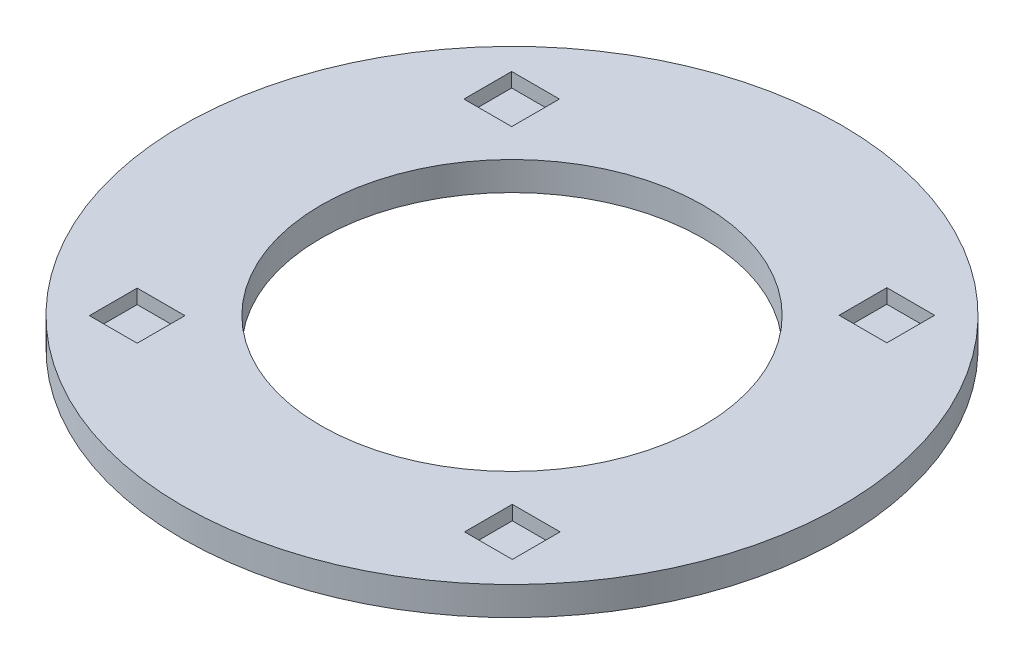
ISO-10303-21;
HEADER;
FILE_DESCRIPTION(('STEP AP214'),'2;1');
FILE_NAME('part.step','',(''),(''),'','','');
FILE_SCHEMA(('AUTOMOTIVE_DESIGN { 1 0 10303 214 1 1 1 1 }'));
ENDSEC;
DATA;
#1=APPLICATION_CONTEXT('core data for automotive mechanical design processes');
#2=APPLICATION_PROTOCOL_DEFINITION('international standard','automotive_design',2000,#1);
#3=PRODUCT_CONTEXT('',#1,'mechanical');
#4=PRODUCT('Part','Part','',(#3));
#5=PRODUCT_RELATED_PRODUCT_CATEGORY('part','',(#4));
#6=PRODUCT_DEFINITION_FORMATION('','',#4);
#7=PRODUCT_DEFINITION_CONTEXT('part definition',#1,'design');
#8=PRODUCT_DEFINITION('design','',#6,#7);
#9=PRODUCT_DEFINITION_SHAPE('','',#8);
#10=(LENGTH_UNIT() NAMED_UNIT(*) SI_UNIT(.MILLI.,.METRE.));
#11=(NAMED_UNIT(*) PLANE_ANGLE_UNIT() SI_UNIT($,.RADIAN.));
#12=(NAMED_UNIT(*) SI_UNIT($,.STERADIAN.) SOLID_ANGLE_UNIT());
#13=UNCERTAINTY_MEASURE_WITH_UNIT(LENGTH_MEASURE(1.E-05),#10,'distance_accuracy_value','');
#14=(GEOMETRIC_REPRESENTATION_CONTEXT(3) GLOBAL_UNCERTAINTY_ASSIGNED_CONTEXT((#13)) GLOBAL_UNIT_ASSIGNED_CONTEXT((#10,
#11,#12)) REPRESENTATION_CONTEXT('',''));
#15=CARTESIAN_POINT('',(0.,0.,0.));
#16=DIRECTION('',(0.,0.,1.));
#17=DIRECTION('',(1.,0.,0.));
#18=AXIS2_PLACEMENT_3D('',#15,#16,#17);
#19=CARTESIAN_POINT('',(0.,3.,0.));
#20=DIRECTION('',(0.,-1.,0.));
#21=DIRECTION('',(0.,0.,-1.));
#22=AXIS2_PLACEMENT_3D('',#19,#20,#21);
#23=CYLINDRICAL_SURFACE('',#22,34.5);
#24=CARTESIAN_POINT('',(0.,3.,0.));
#25=DIRECTION('',(0.,1.,0.));
#26=DIRECTION('',(0.,0.,1.));
#27=AXIS2_PLACEMENT_3D('',#24,#25,#26);
#28=CIRCLE('',#27,34.5);
#29=CARTESIAN_POINT('',(0.,3.,34.5));
#30=VERTEX_POINT('',#29);
#31=EDGE_CURVE('E11',#30,#30,#28,.T.);
#32=ORIENTED_EDGE('',*,*,#31,.F.);
#33=EDGE_LOOP('',(#32));
#34=FACE_BOUND('',#33,.T.);
#35=CARTESIAN_POINT('',(0.,0.,0.));
#36=DIRECTION('',(0.,1.,0.));
#37=DIRECTION('',(0.,0.,1.));
#38=AXIS2_PLACEMENT_3D('',#35,#36,#37);
#39=CIRCLE('',#38,34.5);
#40=CARTESIAN_POINT('',(0.,0.,34.5));
#41=VERTEX_POINT('',#40);
#42=EDGE_CURVE('E38',#41,#41,#39,.T.);
#43=ORIENTED_EDGE('',*,*,#42,.T.);
#44=EDGE_LOOP('',(#43));
#45=FACE_BOUND('',#44,.T.);
#46=ADVANCED_FACE('F35',(#34,#45),#23,.T.);
#47=CARTESIAN_POINT('',(0.,3.,0.));
#48=DIRECTION('',(0.,1.,0.));
#49=DIRECTION('',(0.,0.,1.));
#50=AXIS2_PLACEMENT_3D('',#47,#48,#49);
#51=PLANE('',#50);
#52=DIRECTION('',(1.,0.,0.));
#53=VECTOR('',#52,1.);
#54=CARTESIAN_POINT('',(-22.1031686077329,3.,22.1367412709515));
#55=LINE('',#54,#53);
#56=CARTESIAN_POINT('',(-22.1031686077329,3.,22.1367412709515));
#57=VERTEX_POINT('',#56);
#58=CARTESIAN_POINT('',(-17.1031686077329,3.,22.1367412709515));
#59=VERTEX_POINT('',#58);
#60=EDGE_CURVE('E49',#57,#59,#55,.T.);
#61=ORIENTED_EDGE('',*,*,#60,.F.);
#62=DIRECTION('',(0.,0.,1.));
#63=VECTOR('',#62,1.);
#64=CARTESIAN_POINT('',(-22.1031686077329,3.,17.1367412709515));
#65=LINE('',#64,#63);
#66=CARTESIAN_POINT('',(-22.1031686077329,3.,17.1367412709515));
#67=VERTEX_POINT('',#66);
#68=EDGE_CURVE('E225',#67,#57,#65,.T.);
#69=ORIENTED_EDGE('',*,*,#68,.F.);
#70=DIRECTION('',(-1.,0.,0.));
#71=VECTOR('',#70,1.);
#72=CARTESIAN_POINT('',(-22.1031686077329,3.,17.1367412709515));
#73=LINE('',#72,#71);
#74=CARTESIAN_POINT('',(-17.1031686077329,3.,17.1367412709515));
#75=VERTEX_POINT('',#74);
#76=EDGE_CURVE('E239',#75,#67,#73,.T.);
#77=ORIENTED_EDGE('',*,*,#76,.F.);
#78=DIRECTION('',(0.,0.,-1.));
#79=VECTOR('',#78,1.);
#80=CARTESIAN_POINT('',(-17.1031686077329,3.,17.1367412709515));
#81=LINE('',#80,#79);
#82=EDGE_CURVE('E236',#59,#75,#81,.T.);
#83=ORIENTED_EDGE('',*,*,#82,.F.);
#84=EDGE_LOOP('',(#61,#69,#77,#83));
#85=FACE_BOUND('',#84,.T.);
#86=DIRECTION('',(0.,0.,-1.));
#87=VECTOR('',#86,1.);
#88=CARTESIAN_POINT('',(22.1367412709555,3.,22.103168607733));
#89=LINE('',#88,#87);
#90=CARTESIAN_POINT('',(22.1367412709555,3.,22.103168607733));
#91=VERTEX_POINT('',#90);
#92=CARTESIAN_POINT('',(22.1367412709555,3.,17.103168607733));
#93=VERTEX_POINT('',#92);
#94=EDGE_CURVE('E57',#91,#93,#89,.T.);
#95=ORIENTED_EDGE('',*,*,#94,.F.);
#96=DIRECTION('',(1.,0.,0.));
#97=VECTOR('',#96,1.);
#98=CARTESIAN_POINT('',(17.1367412709555,3.,22.103168607733));
#99=LINE('',#98,#97);
#100=CARTESIAN_POINT('',(17.1367412709555,3.,22.103168607733));
#101=VERTEX_POINT('',#100);
#102=EDGE_CURVE('E195',#101,#91,#99,.T.);
#103=ORIENTED_EDGE('',*,*,#102,.F.);
#104=DIRECTION('',(0.,0.,1.));
#105=VECTOR('',#104,1.);
#106=CARTESIAN_POINT('',(17.1367412709555,3.,22.103168607733));
#107=LINE('',#106,#105);
#108=CARTESIAN_POINT('',(17.1367412709555,3.,17.103168607733));
#109=VERTEX_POINT('',#108);
#110=EDGE_CURVE('E210',#109,#101,#107,.T.);
#111=ORIENTED_EDGE('',*,*,#110,.F.);
#112=DIRECTION('',(-1.,0.,0.));
#113=VECTOR('',#112,1.);
#114=CARTESIAN_POINT('',(17.1367412709555,3.,17.103168607733));
#115=LINE('',#114,#113);
#116=EDGE_CURVE('E206',#93,#109,#115,.T.);
#117=ORIENTED_EDGE('',*,*,#116,.F.);
#118=EDGE_LOOP('',(#95,#103,#111,#117));
#119=FACE_BOUND('',#118,.T.);
#120=DIRECTION('',(-1.,0.,0.));
#121=VECTOR('',#120,1.);
#122=CARTESIAN_POINT('',(22.103168607737,3.,-22.1367412709553));
#123=LINE('',#122,#121);
#124=CARTESIAN_POINT('',(22.103168607737,3.,-22.1367412709553));
#125=VERTEX_POINT('',#124);
#126=CARTESIAN_POINT('',(17.103168607737,3.,-22.1367412709553));
#127=VERTEX_POINT('',#126);
#128=EDGE_CURVE('E154',#125,#127,#123,.T.);
#129=ORIENTED_EDGE('',*,*,#128,.F.);
#130=DIRECTION('',(0.,0.,-1.));
#131=VECTOR('',#130,1.);
#132=CARTESIAN_POINT('',(22.103168607737,3.,-17.1367412709553));
#133=LINE('',#132,#131);
#134=CARTESIAN_POINT('',(22.103168607737,3.,-17.1367412709553));
#135=VERTEX_POINT('',#134);
#136=EDGE_CURVE('E171',#135,#125,#133,.T.);
#137=ORIENTED_EDGE('',*,*,#136,.F.);
#138=DIRECTION('',(1.,0.,0.));
#139=VECTOR('',#138,1.);
#140=CARTESIAN_POINT('',(22.103168607737,3.,-17.1367412709553));
#141=LINE('',#140,#139);
#142=CARTESIAN_POINT('',(17.103168607737,3.,-17.1367412709553));
#143=VERTEX_POINT('',#142);
#144=EDGE_CURVE('E174',#143,#135,#141,.T.);
#145=ORIENTED_EDGE('',*,*,#144,.F.);
#146=DIRECTION('',(0.,0.,1.));
#147=VECTOR('',#146,1.);
#148=CARTESIAN_POINT('',(17.103168607737,3.,-17.1367412709553));
#149=LINE('',#148,#147);
#150=EDGE_CURVE('E180',#127,#143,#149,.T.);
#151=ORIENTED_EDGE('',*,*,#150,.F.);
#152=EDGE_LOOP('',(#129,#137,#145,#151));
#153=FACE_BOUND('',#152,.T.);
#154=DIRECTION('',(0.,0.,1.));
#155=VECTOR('',#154,1.);
#156=CARTESIAN_POINT('',(-22.1367412709513,3.,-22.1031686077369));
#157=LINE('',#156,#155);
#158=CARTESIAN_POINT('',(-22.1367412709513,3.,-22.1031686077369));
#159=VERTEX_POINT('',#158);
#160=CARTESIAN_POINT('',(-22.1367412709513,3.,-17.1031686077369));
#161=VERTEX_POINT('',#160);
#162=EDGE_CURVE('E187',#159,#161,#157,.T.);
#163=ORIENTED_EDGE('',*,*,#162,.F.);
#164=DIRECTION('',(-1.,0.,0.));
#165=VECTOR('',#164,1.);
#166=CARTESIAN_POINT('',(-17.1367412709513,3.,-22.1031686077369));
#167=LINE('',#166,#165);
#168=CARTESIAN_POINT('',(-17.1367412709513,3.,-22.1031686077369));
#169=VERTEX_POINT('',#168);
#170=EDGE_CURVE('E254',#169,#159,#167,.T.);
#171=ORIENTED_EDGE('',*,*,#170,.F.);
#172=DIRECTION('',(0.,0.,-1.));
#173=VECTOR('',#172,1.);
#174=CARTESIAN_POINT('',(-17.1367412709513,3.,-22.1031686077369));
#175=LINE('',#174,#173);
#176=CARTESIAN_POINT('',(-17.1367412709513,3.,-17.1031686077369));
#177=VERTEX_POINT('',#176);
#178=EDGE_CURVE('E268',#177,#169,#175,.T.);
#179=ORIENTED_EDGE('',*,*,#178,.F.);
#180=DIRECTION('',(1.,0.,0.));
#181=VECTOR('',#180,1.);
#182=CARTESIAN_POINT('',(-17.1367412709513,3.,-17.1031686077369));
#183=LINE('',#182,#181);
#184=EDGE_CURVE('E265',#161,#177,#183,.T.);
#185=ORIENTED_EDGE('',*,*,#184,.F.);
#186=EDGE_LOOP('',(#163,#171,#179,#185));
#187=FACE_BOUND('',#186,.T.);
#188=CARTESIAN_POINT('',(0.,3.,0.));
#189=DIRECTION('',(0.,1.,0.));
#190=DIRECTION('',(0.,0.,1.));
#191=AXIS2_PLACEMENT_3D('',#188,#189,#190);
#192=CIRCLE('',#191,20.);
#193=CARTESIAN_POINT('',(0.,3.,20.));
#194=VERTEX_POINT('',#193);
#195=EDGE_CURVE('E275',#194,#194,#192,.T.);
#196=ORIENTED_EDGE('',*,*,#195,.F.);
#197=EDGE_LOOP('',(#196));
#198=FACE_BOUND('',#197,.T.);
#199=ORIENTED_EDGE('',*,*,#31,.T.);
#200=EDGE_LOOP('',(#199));
#201=FACE_BOUND('',#200,.T.);
#202=ADVANCED_FACE('F290',(#85,#119,#153,#187,#198,#201),#51,.T.);
#203=CARTESIAN_POINT('',(0.,0.,0.));
#204=DIRECTION('',(0.,1.,0.));
#205=DIRECTION('',(0.,0.,1.));
#206=AXIS2_PLACEMENT_3D('',#203,#204,#205);
#207=PLANE('',#206);
#208=CARTESIAN_POINT('',(0.,0.,0.));
#209=DIRECTION('',(0.,1.,0.));
#210=DIRECTION('',(0.,0.,1.));
#211=AXIS2_PLACEMENT_3D('',#208,#209,#210);
#212=CIRCLE('',#211,20.);
#213=CARTESIAN_POINT('',(0.,0.,20.));
#214=VERTEX_POINT('',#213);
#215=EDGE_CURVE('E282',#214,#214,#212,.T.);
#216=ORIENTED_EDGE('',*,*,#215,.T.);
#217=EDGE_LOOP('',(#216));
#218=FACE_BOUND('',#217,.T.);
#219=ORIENTED_EDGE('',*,*,#42,.F.);
#220=EDGE_LOOP('',(#219));
#221=FACE_BOUND('',#220,.T.);
#222=ADVANCED_FACE('F293',(#218,#221),#207,.F.);
#223=CARTESIAN_POINT('',(0.,0.,0.));
#224=DIRECTION('',(0.,1.,0.));
#225=DIRECTION('',(0.,0.,1.));
#226=AXIS2_PLACEMENT_3D('',#223,#224,#225);
#227=CYLINDRICAL_SURFACE('',#226,20.);
#228=ORIENTED_EDGE('',*,*,#215,.F.);
#229=EDGE_LOOP('',(#228));
#230=FACE_BOUND('',#229,.T.);
#231=ORIENTED_EDGE('',*,*,#195,.T.);
#232=EDGE_LOOP('',(#231));
#233=FACE_BOUND('',#232,.T.);
#234=ADVANCED_FACE('F288',(#230,#233),#227,.F.);
#235=CARTESIAN_POINT('',(-22.1367412709513,1.5,-22.1031686077369));
#236=DIRECTION('',(-1.,0.,0.));
#237=DIRECTION('',(0.,0.,1.));
#238=AXIS2_PLACEMENT_3D('',#235,#236,#237);
#239=PLANE('',#238);
#240=ORIENTED_EDGE('',*,*,#162,.T.);
#241=DIRECTION('',(0.,1.,0.));
#242=VECTOR('',#241,1.);
#243=CARTESIAN_POINT('',(-22.1367412709513,1.5,-17.1031686077369));
#244=LINE('',#243,#242);
#245=CARTESIAN_POINT('',(-22.1367412709513,1.5,-17.1031686077369));
#246=VERTEX_POINT('',#245);
#247=EDGE_CURVE('E263',#246,#161,#244,.T.);
#248=ORIENTED_EDGE('',*,*,#247,.F.);
#249=DIRECTION('',(0.,0.,1.));
#250=VECTOR('',#249,1.);
#251=CARTESIAN_POINT('',(-22.1367412709513,1.5,-22.1031686077369));
#252=LINE('',#251,#250);
#253=CARTESIAN_POINT('',(-22.1367412709513,1.5,-22.1031686077369));
#254=VERTEX_POINT('',#253);
#255=EDGE_CURVE('E250',#254,#246,#252,.T.);
#256=ORIENTED_EDGE('',*,*,#255,.F.);
#257=DIRECTION('',(0.,1.,0.));
#258=VECTOR('',#257,1.);
#259=CARTESIAN_POINT('',(-22.1367412709513,1.5,-22.1031686077369));
#260=LINE('',#259,#258);
#261=EDGE_CURVE('E273',#254,#159,#260,.T.);
#262=ORIENTED_EDGE('',*,*,#261,.T.);
#263=EDGE_LOOP('',(#240,#248,#256,#262));
#264=FACE_BOUND('',#263,.T.);
#265=ADVANCED_FACE('F308',(#264),#239,.F.);
#266=CARTESIAN_POINT('',(-17.1367412709513,1.5,-22.1031686077369));
#267=DIRECTION('',(0.,0.,-1.));
#268=DIRECTION('',(-1.,0.,0.));
#269=AXIS2_PLACEMENT_3D('',#266,#267,#268);
#270=PLANE('',#269);
#271=ORIENTED_EDGE('',*,*,#170,.T.);
#272=ORIENTED_EDGE('',*,*,#261,.F.);
#273=DIRECTION('',(-1.,0.,0.));
#274=VECTOR('',#273,1.);
#275=CARTESIAN_POINT('',(-17.1367412709513,1.5,-22.1031686077369));
#276=LINE('',#275,#274);
#277=CARTESIAN_POINT('',(-17.1367412709513,1.5,-22.1031686077369));
#278=VERTEX_POINT('',#277);
#279=EDGE_CURVE('E260',#278,#254,#276,.T.);
#280=ORIENTED_EDGE('',*,*,#279,.F.);
#281=DIRECTION('',(0.,1.,0.));
#282=VECTOR('',#281,1.);
#283=CARTESIAN_POINT('',(-17.1367412709513,1.5,-22.1031686077369));
#284=LINE('',#283,#282);
#285=EDGE_CURVE('E276',#278,#169,#284,.T.);
#286=ORIENTED_EDGE('',*,*,#285,.T.);
#287=EDGE_LOOP('',(#271,#272,#280,#286));
#288=FACE_BOUND('',#287,.T.);
#289=ADVANCED_FACE('F314',(#288),#270,.F.);
#290=CARTESIAN_POINT('',(-17.1367412709513,1.5,-22.1031686077369));
#291=DIRECTION('',(1.,0.,0.));
#292=DIRECTION('',(0.,0.,-1.));
#293=AXIS2_PLACEMENT_3D('',#290,#291,#292);
#294=PLANE('',#293);
#295=ORIENTED_EDGE('',*,*,#178,.T.);
#296=ORIENTED_EDGE('',*,*,#285,.F.);
#297=DIRECTION('',(0.,0.,-1.));
#298=VECTOR('',#297,1.);
#299=CARTESIAN_POINT('',(-17.1367412709513,1.5,-22.1031686077369));
#300=LINE('',#299,#298);
#301=CARTESIAN_POINT('',(-17.1367412709513,1.5,-17.1031686077369));
#302=VERTEX_POINT('',#301);
#303=EDGE_CURVE('E257',#302,#278,#300,.T.);
#304=ORIENTED_EDGE('',*,*,#303,.F.);
#305=DIRECTION('',(0.,1.,0.));
#306=VECTOR('',#305,1.);
#307=CARTESIAN_POINT('',(-17.1367412709513,1.5,-17.1031686077369));
#308=LINE('',#307,#306);
#309=EDGE_CURVE('E278',#302,#177,#308,.T.);
#310=ORIENTED_EDGE('',*,*,#309,.T.);
#311=EDGE_LOOP('',(#295,#296,#304,#310));
#312=FACE_BOUND('',#311,.T.);
#313=ADVANCED_FACE('F320',(#312),#294,.F.);
#314=CARTESIAN_POINT('',(-17.1367412709513,1.5,-17.1031686077369));
#315=DIRECTION('',(0.,0.,1.));
#316=DIRECTION('',(1.,0.,0.));
#317=AXIS2_PLACEMENT_3D('',#314,#315,#316);
#318=PLANE('',#317);
#319=ORIENTED_EDGE('',*,*,#184,.T.);
#320=ORIENTED_EDGE('',*,*,#309,.F.);
#321=DIRECTION('',(1.,0.,0.));
#322=VECTOR('',#321,1.);
#323=CARTESIAN_POINT('',(-17.1367412709513,1.5,-17.1031686077369));
#324=LINE('',#323,#322);
#325=EDGE_CURVE('E253',#246,#302,#324,.T.);
#326=ORIENTED_EDGE('',*,*,#325,.F.);
#327=ORIENTED_EDGE('',*,*,#247,.T.);
#328=EDGE_LOOP('',(#319,#320,#326,#327));
#329=FACE_BOUND('',#328,.T.);
#330=ADVANCED_FACE('F316',(#329),#318,.F.);
#331=CARTESIAN_POINT('',(0.,1.5,0.));
#332=DIRECTION('',(0.,-1.,0.));
#333=DIRECTION('',(0.,0.,-1.));
#334=AXIS2_PLACEMENT_3D('',#331,#332,#333);
#335=PLANE('',#334);
#336=ORIENTED_EDGE('',*,*,#255,.T.);
#337=ORIENTED_EDGE('',*,*,#325,.T.);
#338=ORIENTED_EDGE('',*,*,#303,.T.);
#339=ORIENTED_EDGE('',*,*,#279,.T.);
#340=EDGE_LOOP('',(#336,#337,#338,#339));
#341=FACE_BOUND('',#340,.T.);
#342=ADVANCED_FACE('F319',(#341),#335,.F.);
#343=CARTESIAN_POINT('',(22.103168607737,1.5,-22.1367412709553));
#344=DIRECTION('',(0.,0.,-1.));
#345=DIRECTION('',(-1.,0.,0.));
#346=AXIS2_PLACEMENT_3D('',#343,#344,#345);
#347=PLANE('',#346);
#348=ORIENTED_EDGE('',*,*,#128,.T.);
#349=DIRECTION('',(0.,1.,0.));
#350=VECTOR('',#349,1.);
#351=CARTESIAN_POINT('',(17.103168607737,1.5,-22.1367412709553));
#352=LINE('',#351,#350);
#353=CARTESIAN_POINT('',(17.103168607737,1.5,-22.1367412709553));
#354=VERTEX_POINT('',#353);
#355=EDGE_CURVE('E147',#354,#127,#352,.T.);
#356=ORIENTED_EDGE('',*,*,#355,.F.);
#357=DIRECTION('',(-1.,0.,0.));
#358=VECTOR('',#357,1.);
#359=CARTESIAN_POINT('',(22.103168607737,1.5,-22.1367412709553));
#360=LINE('',#359,#358);
#361=CARTESIAN_POINT('',(22.103168607737,1.5,-22.1367412709553));
#362=VERTEX_POINT('',#361);
#363=EDGE_CURVE('E151',#362,#354,#360,.T.);
#364=ORIENTED_EDGE('',*,*,#363,.F.);
#365=DIRECTION('',(0.,1.,0.));
#366=VECTOR('',#365,1.);
#367=CARTESIAN_POINT('',(22.103168607737,1.5,-22.1367412709553));
#368=LINE('',#367,#366);
#369=EDGE_CURVE('E185',#362,#125,#368,.T.);
#370=ORIENTED_EDGE('',*,*,#369,.T.);
#371=EDGE_LOOP('',(#348,#356,#364,#370));
#372=FACE_BOUND('',#371,.T.);
#373=ADVANCED_FACE('F149',(#372),#347,.F.);
#374=CARTESIAN_POINT('',(22.103168607737,1.5,-17.1367412709553));
#375=DIRECTION('',(1.,0.,0.));
#376=DIRECTION('',(0.,0.,-1.));
#377=AXIS2_PLACEMENT_3D('',#374,#375,#376);
#378=PLANE('',#377);
#379=ORIENTED_EDGE('',*,*,#136,.T.);
#380=ORIENTED_EDGE('',*,*,#369,.F.);
#381=DIRECTION('',(0.,0.,-1.));
#382=VECTOR('',#381,1.);
#383=CARTESIAN_POINT('',(22.103168607737,1.5,-17.1367412709553));
#384=LINE('',#383,#382);
#385=CARTESIAN_POINT('',(22.103168607737,1.5,-17.1367412709553));
#386=VERTEX_POINT('',#385);
#387=EDGE_CURVE('E159',#386,#362,#384,.T.);
#388=ORIENTED_EDGE('',*,*,#387,.F.);
#389=DIRECTION('',(0.,1.,0.));
#390=VECTOR('',#389,1.);
#391=CARTESIAN_POINT('',(22.103168607737,1.5,-17.1367412709553));
#392=LINE('',#391,#390);
#393=EDGE_CURVE('E188',#386,#135,#392,.T.);
#394=ORIENTED_EDGE('',*,*,#393,.T.);
#395=EDGE_LOOP('',(#379,#380,#388,#394));
#396=FACE_BOUND('',#395,.T.);
#397=ADVANCED_FACE('F371',(#396),#378,.F.);
#398=CARTESIAN_POINT('',(22.103168607737,1.5,-17.1367412709553));
#399=DIRECTION('',(0.,0.,1.));
#400=DIRECTION('',(1.,0.,0.));
#401=AXIS2_PLACEMENT_3D('',#398,#399,#400);
#402=PLANE('',#401);
#403=ORIENTED_EDGE('',*,*,#144,.T.);
#404=ORIENTED_EDGE('',*,*,#393,.F.);
#405=DIRECTION('',(1.,0.,0.));
#406=VECTOR('',#405,1.);
#407=CARTESIAN_POINT('',(22.103168607737,1.5,-17.1367412709553));
#408=LINE('',#407,#406);
#409=CARTESIAN_POINT('',(17.103168607737,1.5,-17.1367412709553));
#410=VERTEX_POINT('',#409);
#411=EDGE_CURVE('E167',#410,#386,#408,.T.);
#412=ORIENTED_EDGE('',*,*,#411,.F.);
#413=DIRECTION('',(0.,1.,0.));
#414=VECTOR('',#413,1.);
#415=CARTESIAN_POINT('',(17.103168607737,1.5,-17.1367412709553));
#416=LINE('',#415,#414);
#417=EDGE_CURVE('E158',#410,#143,#416,.T.);
#418=ORIENTED_EDGE('',*,*,#417,.T.);
#419=EDGE_LOOP('',(#403,#404,#412,#418));
#420=FACE_BOUND('',#419,.T.);
#421=ADVANCED_FACE('F374',(#420),#402,.F.);
#422=CARTESIAN_POINT('',(17.103168607737,1.5,-17.1367412709553));
#423=DIRECTION('',(-1.,0.,0.));
#424=DIRECTION('',(0.,0.,1.));
#425=AXIS2_PLACEMENT_3D('',#422,#423,#424);
#426=PLANE('',#425);
#427=ORIENTED_EDGE('',*,*,#150,.T.);
#428=ORIENTED_EDGE('',*,*,#417,.F.);
#429=DIRECTION('',(0.,0.,1.));
#430=VECTOR('',#429,1.);
#431=CARTESIAN_POINT('',(17.103168607737,1.5,-17.1367412709553));
#432=LINE('',#431,#430);
#433=EDGE_CURVE('E162',#354,#410,#432,.T.);
#434=ORIENTED_EDGE('',*,*,#433,.F.);
#435=ORIENTED_EDGE('',*,*,#355,.T.);
#436=EDGE_LOOP('',(#427,#428,#434,#435));
#437=FACE_BOUND('',#436,.T.);
#438=ADVANCED_FACE('F163',(#437),#426,.F.);
#439=CARTESIAN_POINT('',(0.,1.5,0.));
#440=DIRECTION('',(0.,-1.,0.));
#441=DIRECTION('',(0.,0.,-1.));
#442=AXIS2_PLACEMENT_3D('',#439,#440,#441);
#443=PLANE('',#442);
#444=ORIENTED_EDGE('',*,*,#363,.T.);
#445=ORIENTED_EDGE('',*,*,#433,.T.);
#446=ORIENTED_EDGE('',*,*,#411,.T.);
#447=ORIENTED_EDGE('',*,*,#387,.T.);
#448=EDGE_LOOP('',(#444,#445,#446,#447));
#449=FACE_BOUND('',#448,.T.);
#450=ADVANCED_FACE('F169',(#449),#443,.F.);
#451=CARTESIAN_POINT('',(22.1367412709555,1.5,22.103168607733));
#452=DIRECTION('',(1.,0.,0.));
#453=DIRECTION('',(0.,0.,-1.));
#454=AXIS2_PLACEMENT_3D('',#451,#452,#453);
#455=PLANE('',#454);
#456=ORIENTED_EDGE('',*,*,#94,.T.);
#457=DIRECTION('',(0.,1.,0.));
#458=VECTOR('',#457,1.);
#459=CARTESIAN_POINT('',(22.1367412709555,1.5,17.103168607733));
#460=LINE('',#459,#458);
#461=CARTESIAN_POINT('',(22.1367412709555,1.5,17.103168607733));
#462=VERTEX_POINT('',#461);
#463=EDGE_CURVE('E204',#462,#93,#460,.T.);
#464=ORIENTED_EDGE('',*,*,#463,.F.);
#465=DIRECTION('',(0.,0.,-1.));
#466=VECTOR('',#465,1.);
#467=CARTESIAN_POINT('',(22.1367412709555,1.5,22.103168607733));
#468=LINE('',#467,#466);
#469=CARTESIAN_POINT('',(22.1367412709555,1.5,22.103168607733));
#470=VERTEX_POINT('',#469);
#471=EDGE_CURVE('E191',#470,#462,#468,.T.);
#472=ORIENTED_EDGE('',*,*,#471,.F.);
#473=DIRECTION('',(0.,1.,0.));
#474=VECTOR('',#473,1.);
#475=CARTESIAN_POINT('',(22.1367412709555,1.5,22.103168607733));
#476=LINE('',#475,#474);
#477=EDGE_CURVE('E181',#470,#91,#476,.T.);
#478=ORIENTED_EDGE('',*,*,#477,.T.);
#479=EDGE_LOOP('',(#456,#464,#472,#478));
#480=FACE_BOUND('',#479,.T.);
#481=ADVANCED_FACE('F351',(#480),#455,.F.);
#482=CARTESIAN_POINT('',(17.1367412709555,1.5,22.103168607733));
#483=DIRECTION('',(0.,0.,1.));
#484=DIRECTION('',(1.,0.,0.));
#485=AXIS2_PLACEMENT_3D('',#482,#483,#484);
#486=PLANE('',#485);
#487=ORIENTED_EDGE('',*,*,#102,.T.);
#488=ORIENTED_EDGE('',*,*,#477,.F.);
#489=DIRECTION('',(1.,0.,0.));
#490=VECTOR('',#489,1.);
#491=CARTESIAN_POINT('',(17.1367412709555,1.5,22.103168607733));
#492=LINE('',#491,#490);
#493=CARTESIAN_POINT('',(17.1367412709555,1.5,22.103168607733));
#494=VERTEX_POINT('',#493);
#495=EDGE_CURVE('E201',#494,#470,#492,.T.);
#496=ORIENTED_EDGE('',*,*,#495,.F.);
#497=DIRECTION('',(0.,1.,0.));
#498=VECTOR('',#497,1.);
#499=CARTESIAN_POINT('',(17.1367412709555,1.5,22.103168607733));
#500=LINE('',#499,#498);
#501=EDGE_CURVE('E216',#494,#101,#500,.T.);
#502=ORIENTED_EDGE('',*,*,#501,.T.);
#503=EDGE_LOOP('',(#487,#488,#496,#502));
#504=FACE_BOUND('',#503,.T.);
#505=ADVANCED_FACE('F354',(#504),#486,.F.);
#506=CARTESIAN_POINT('',(17.1367412709555,1.5,22.103168607733));
#507=DIRECTION('',(-1.,0.,0.));
#508=DIRECTION('',(0.,0.,1.));
#509=AXIS2_PLACEMENT_3D('',#506,#507,#508);
#510=PLANE('',#509);
#511=ORIENTED_EDGE('',*,*,#110,.T.);
#512=ORIENTED_EDGE('',*,*,#501,.F.);
#513=DIRECTION('',(0.,0.,1.));
#514=VECTOR('',#513,1.);
#515=CARTESIAN_POINT('',(17.1367412709555,1.5,22.103168607733));
#516=LINE('',#515,#514);
#517=CARTESIAN_POINT('',(17.1367412709555,1.5,17.103168607733));
#518=VERTEX_POINT('',#517);
#519=EDGE_CURVE('E198',#518,#494,#516,.T.);
#520=ORIENTED_EDGE('',*,*,#519,.F.);
#521=DIRECTION('',(0.,1.,0.));
#522=VECTOR('',#521,1.);
#523=CARTESIAN_POINT('',(17.1367412709555,1.5,17.103168607733));
#524=LINE('',#523,#522);
#525=EDGE_CURVE('E218',#518,#109,#524,.T.);
#526=ORIENTED_EDGE('',*,*,#525,.T.);
#527=EDGE_LOOP('',(#511,#512,#520,#526));
#528=FACE_BOUND('',#527,.T.);
#529=ADVANCED_FACE('F358',(#528),#510,.F.);
#530=CARTESIAN_POINT('',(17.1367412709555,1.5,17.103168607733));
#531=DIRECTION('',(0.,0.,-1.));
#532=DIRECTION('',(-1.,0.,0.));
#533=AXIS2_PLACEMENT_3D('',#530,#531,#532);
#534=PLANE('',#533);
#535=ORIENTED_EDGE('',*,*,#116,.T.);
#536=ORIENTED_EDGE('',*,*,#525,.F.);
#537=DIRECTION('',(-1.,0.,0.));
#538=VECTOR('',#537,1.);
#539=CARTESIAN_POINT('',(17.1367412709555,1.5,17.103168607733));
#540=LINE('',#539,#538);
#541=EDGE_CURVE('E194',#462,#518,#540,.T.);
#542=ORIENTED_EDGE('',*,*,#541,.F.);
#543=ORIENTED_EDGE('',*,*,#463,.T.);
#544=EDGE_LOOP('',(#535,#536,#542,#543));
#545=FACE_BOUND('',#544,.T.);
#546=ADVANCED_FACE('F355',(#545),#534,.F.);
#547=CARTESIAN_POINT('',(0.,1.5,0.));
#548=DIRECTION('',(0.,-1.,0.));
#549=DIRECTION('',(0.,0.,-1.));
#550=AXIS2_PLACEMENT_3D('',#547,#548,#549);
#551=PLANE('',#550);
#552=ORIENTED_EDGE('',*,*,#471,.T.);
#553=ORIENTED_EDGE('',*,*,#541,.T.);
#554=ORIENTED_EDGE('',*,*,#519,.T.);
#555=ORIENTED_EDGE('',*,*,#495,.T.);
#556=EDGE_LOOP('',(#552,#553,#554,#555));
#557=FACE_BOUND('',#556,.T.);
#558=ADVANCED_FACE('F335',(#557),#551,.F.);
#559=CARTESIAN_POINT('',(-22.1031686077329,1.5,22.1367412709515));
#560=DIRECTION('',(0.,0.,1.));
#561=DIRECTION('',(1.,0.,0.));
#562=AXIS2_PLACEMENT_3D('',#559,#560,#561);
#563=PLANE('',#562);
#564=ORIENTED_EDGE('',*,*,#60,.T.);
#565=DIRECTION('',(0.,1.,0.));
#566=VECTOR('',#565,1.);
#567=CARTESIAN_POINT('',(-17.1031686077329,1.5,22.1367412709515));
#568=LINE('',#567,#566);
#569=CARTESIAN_POINT('',(-17.1031686077329,1.5,22.1367412709515));
#570=VERTEX_POINT('',#569);
#571=EDGE_CURVE('E234',#570,#59,#568,.T.);
#572=ORIENTED_EDGE('',*,*,#571,.F.);
#573=DIRECTION('',(1.,0.,0.));
#574=VECTOR('',#573,1.);
#575=CARTESIAN_POINT('',(-22.1031686077329,1.5,22.1367412709515));
#576=LINE('',#575,#574);
#577=CARTESIAN_POINT('',(-22.1031686077329,1.5,22.1367412709515));
#578=VERTEX_POINT('',#577);
#579=EDGE_CURVE('E221',#578,#570,#576,.T.);
#580=ORIENTED_EDGE('',*,*,#579,.F.);
#581=DIRECTION('',(0.,1.,0.));
#582=VECTOR('',#581,1.);
#583=CARTESIAN_POINT('',(-22.1031686077329,1.5,22.1367412709515));
#584=LINE('',#583,#582);
#585=EDGE_CURVE('E207',#578,#57,#584,.T.);
#586=ORIENTED_EDGE('',*,*,#585,.T.);
#587=EDGE_LOOP('',(#564,#572,#580,#586));
#588=FACE_BOUND('',#587,.T.);
#589=ADVANCED_FACE('F331',(#588),#563,.F.);
#590=CARTESIAN_POINT('',(-22.1031686077329,1.5,17.1367412709515));
#591=DIRECTION('',(-1.,0.,0.));
#592=DIRECTION('',(0.,0.,1.));
#593=AXIS2_PLACEMENT_3D('',#590,#591,#592);
#594=PLANE('',#593);
#595=ORIENTED_EDGE('',*,*,#68,.T.);
#596=ORIENTED_EDGE('',*,*,#585,.F.);
#597=DIRECTION('',(0.,0.,1.));
#598=VECTOR('',#597,1.);
#599=CARTESIAN_POINT('',(-22.1031686077329,1.5,17.1367412709515));
#600=LINE('',#599,#598);
#601=CARTESIAN_POINT('',(-22.1031686077329,1.5,17.1367412709515));
#602=VERTEX_POINT('',#601);
#603=EDGE_CURVE('E231',#602,#578,#600,.T.);
#604=ORIENTED_EDGE('',*,*,#603,.F.);
#605=DIRECTION('',(0.,1.,0.));
#606=VECTOR('',#605,1.);
#607=CARTESIAN_POINT('',(-22.1031686077329,1.5,17.1367412709515));
#608=LINE('',#607,#606);
#609=EDGE_CURVE('E245',#602,#67,#608,.T.);
#610=ORIENTED_EDGE('',*,*,#609,.T.);
#611=EDGE_LOOP('',(#595,#596,#604,#610));
#612=FACE_BOUND('',#611,.T.);
#613=ADVANCED_FACE('F334',(#612),#594,.F.);
#614=CARTESIAN_POINT('',(-22.1031686077329,1.5,17.1367412709515));
#615=DIRECTION('',(0.,0.,-1.));
#616=DIRECTION('',(-1.,0.,0.));
#617=AXIS2_PLACEMENT_3D('',#614,#615,#616);
#618=PLANE('',#617);
#619=ORIENTED_EDGE('',*,*,#76,.T.);
#620=ORIENTED_EDGE('',*,*,#609,.F.);
#621=DIRECTION('',(-1.,0.,0.));
#622=VECTOR('',#621,1.);
#623=CARTESIAN_POINT('',(-22.1031686077329,1.5,17.1367412709515));
#624=LINE('',#623,#622);
#625=CARTESIAN_POINT('',(-17.1031686077329,1.5,17.1367412709515));
#626=VERTEX_POINT('',#625);
#627=EDGE_CURVE('E228',#626,#602,#624,.T.);
#628=ORIENTED_EDGE('',*,*,#627,.F.);
#629=DIRECTION('',(0.,1.,0.));
#630=VECTOR('',#629,1.);
#631=CARTESIAN_POINT('',(-17.1031686077329,1.5,17.1367412709515));
#632=LINE('',#631,#630);
#633=EDGE_CURVE('E247',#626,#75,#632,.T.);
#634=ORIENTED_EDGE('',*,*,#633,.T.);
#635=EDGE_LOOP('',(#619,#620,#628,#634));
#636=FACE_BOUND('',#635,.T.);
#637=ADVANCED_FACE('F340',(#636),#618,.F.);
#638=CARTESIAN_POINT('',(-17.1031686077329,1.5,17.1367412709515));
#639=DIRECTION('',(1.,0.,0.));
#640=DIRECTION('',(0.,0.,-1.));
#641=AXIS2_PLACEMENT_3D('',#638,#639,#640);
#642=PLANE('',#641);
#643=ORIENTED_EDGE('',*,*,#82,.T.);
#644=ORIENTED_EDGE('',*,*,#633,.F.);
#645=DIRECTION('',(0.,0.,-1.));
#646=VECTOR('',#645,1.);
#647=CARTESIAN_POINT('',(-17.1031686077329,1.5,17.1367412709515));
#648=LINE('',#647,#646);
#649=EDGE_CURVE('E224',#570,#626,#648,.T.);
#650=ORIENTED_EDGE('',*,*,#649,.F.);
#651=ORIENTED_EDGE('',*,*,#571,.T.);
#652=EDGE_LOOP('',(#643,#644,#650,#651));
#653=FACE_BOUND('',#652,.T.);
#654=ADVANCED_FACE('F336',(#653),#642,.F.);
#655=CARTESIAN_POINT('',(0.,1.5,0.));
#656=DIRECTION('',(0.,-1.,0.));
#657=DIRECTION('',(0.,0.,-1.));
#658=AXIS2_PLACEMENT_3D('',#655,#656,#657);
#659=PLANE('',#658);
#660=ORIENTED_EDGE('',*,*,#579,.T.);
#661=ORIENTED_EDGE('',*,*,#649,.T.);
#662=ORIENTED_EDGE('',*,*,#627,.T.);
#663=ORIENTED_EDGE('',*,*,#603,.T.);
#664=EDGE_LOOP('',(#660,#661,#662,#663));
#665=FACE_BOUND('',#664,.T.);
#666=ADVANCED_FACE('F339',(#665),#659,.F.);
#667=CLOSED_SHELL('',(#46,#202,#222,#234,#265,#289,#313,#330,#342,#373,#397,#421,#438,#450,#481,
#505,#529,#546,#558,#589,#613,#637,#654,#666));
#668=MANIFOLD_SOLID_BREP('B2',#667);
#669=ADVANCED_BREP_SHAPE_REPRESENTATION('',(#18,#668),#14);
#670=SHAPE_DEFINITION_REPRESENTATION(#9,#669);
ENDSEC;
END-ISO-10303-21;
